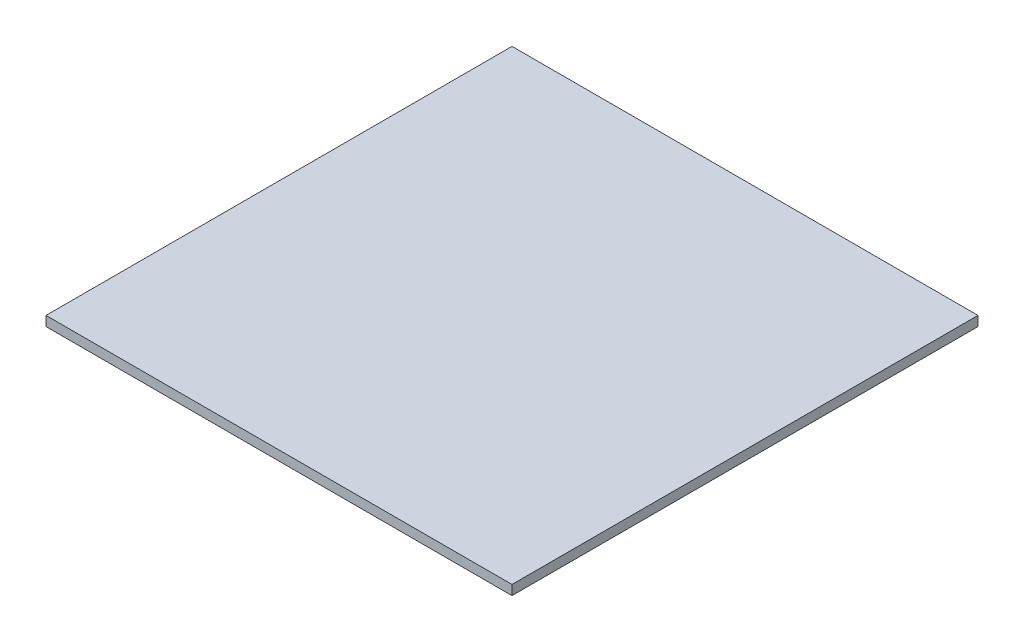
ISO-10303-21;
HEADER;
FILE_DESCRIPTION(('STEP AP214'),'2;1');
FILE_NAME('part.step','',(''),(''),'','','');
FILE_SCHEMA(('AUTOMOTIVE_DESIGN { 1 0 10303 214 1 1 1 1 }'));
ENDSEC;
DATA;
#1=APPLICATION_CONTEXT('core data for automotive mechanical design processes');
#2=APPLICATION_PROTOCOL_DEFINITION('international standard','automotive_design',2000,#1);
#3=PRODUCT_CONTEXT('',#1,'mechanical');
#4=PRODUCT('Part','Part','',(#3));
#5=PRODUCT_RELATED_PRODUCT_CATEGORY('part','',(#4));
#6=PRODUCT_DEFINITION_FORMATION('','',#4);
#7=PRODUCT_DEFINITION_CONTEXT('part definition',#1,'design');
#8=PRODUCT_DEFINITION('design','',#6,#7);
#9=PRODUCT_DEFINITION_SHAPE('','',#8);
#10=(LENGTH_UNIT() NAMED_UNIT(*) SI_UNIT(.MILLI.,.METRE.));
#11=(NAMED_UNIT(*) PLANE_ANGLE_UNIT() SI_UNIT($,.RADIAN.));
#12=(NAMED_UNIT(*) SI_UNIT($,.STERADIAN.) SOLID_ANGLE_UNIT());
#13=UNCERTAINTY_MEASURE_WITH_UNIT(LENGTH_MEASURE(1.E-05),#10,'distance_accuracy_value','');
#14=(GEOMETRIC_REPRESENTATION_CONTEXT(3) GLOBAL_UNCERTAINTY_ASSIGNED_CONTEXT((#13)) GLOBAL_UNIT_ASSIGNED_CONTEXT((#10,
#11,#12)) REPRESENTATION_CONTEXT('',''));
#15=CARTESIAN_POINT('',(0.,0.,0.));
#16=DIRECTION('',(0.,0.,1.));
#17=DIRECTION('',(1.,0.,0.));
#18=AXIS2_PLACEMENT_3D('',#15,#16,#17);
#19=CARTESIAN_POINT('',(438.94375,18.25625,438.94375));
#20=DIRECTION('',(-1.,0.,0.));
#21=DIRECTION('',(0.,0.,1.));
#22=AXIS2_PLACEMENT_3D('',#19,#20,#21);
#23=PLANE('',#22);
#24=DIRECTION('',(0.,0.,-1.));
#25=VECTOR('',#24,1.);
#26=CARTESIAN_POINT('',(438.94375,0.,438.94375));
#27=LINE('',#26,#25);
#28=CARTESIAN_POINT('',(438.94375,0.,438.94375));
#29=VERTEX_POINT('',#28);
#30=CARTESIAN_POINT('',(438.94375,0.,-438.94375));
#31=VERTEX_POINT('',#30);
#32=EDGE_CURVE('E107',#29,#31,#27,.T.);
#33=ORIENTED_EDGE('',*,*,#32,.T.);
#34=DIRECTION('',(0.,-1.,0.));
#35=VECTOR('',#34,1.);
#36=CARTESIAN_POINT('',(438.94375,18.25625,-438.94375));
#37=LINE('',#36,#35);
#38=CARTESIAN_POINT('',(438.94375,18.25625,-438.94375));
#39=VERTEX_POINT('',#38);
#40=EDGE_CURVE('E11',#39,#31,#37,.T.);
#41=ORIENTED_EDGE('',*,*,#40,.F.);
#42=DIRECTION('',(0.,0.,-1.));
#43=VECTOR('',#42,1.);
#44=CARTESIAN_POINT('',(438.94375,18.25625,438.94375));
#45=LINE('',#44,#43);
#46=CARTESIAN_POINT('',(438.94375,18.25625,438.94375));
#47=VERTEX_POINT('',#46);
#48=EDGE_CURVE('E91',#47,#39,#45,.T.);
#49=ORIENTED_EDGE('',*,*,#48,.F.);
#50=DIRECTION('',(0.,-1.,0.));
#51=VECTOR('',#50,1.);
#52=CARTESIAN_POINT('',(438.94375,18.25625,438.94375));
#53=LINE('',#52,#51);
#54=EDGE_CURVE('E103',#47,#29,#53,.T.);
#55=ORIENTED_EDGE('',*,*,#54,.T.);
#56=EDGE_LOOP('',(#33,#41,#49,#55));
#57=FACE_BOUND('',#56,.T.);
#58=ADVANCED_FACE('F39',(#57),#23,.F.);
#59=CARTESIAN_POINT('',(-438.94375,18.25625,-438.94375));
#60=DIRECTION('',(0.,0.,1.));
#61=DIRECTION('',(1.,0.,0.));
#62=AXIS2_PLACEMENT_3D('',#59,#60,#61);
#63=PLANE('',#62);
#64=DIRECTION('',(-1.,0.,0.));
#65=VECTOR('',#64,1.);
#66=CARTESIAN_POINT('',(-438.94375,0.,-438.94375));
#67=LINE('',#66,#65);
#68=CARTESIAN_POINT('',(-438.94375,0.,-438.94375));
#69=VERTEX_POINT('',#68);
#70=EDGE_CURVE('E96',#31,#69,#67,.T.);
#71=ORIENTED_EDGE('',*,*,#70,.T.);
#72=DIRECTION('',(0.,-1.,0.));
#73=VECTOR('',#72,1.);
#74=CARTESIAN_POINT('',(-438.94375,18.25625,-438.94375));
#75=LINE('',#74,#73);
#76=CARTESIAN_POINT('',(-438.94375,18.25625,-438.94375));
#77=VERTEX_POINT('',#76);
#78=EDGE_CURVE('E48',#77,#69,#75,.T.);
#79=ORIENTED_EDGE('',*,*,#78,.F.);
#80=DIRECTION('',(-1.,0.,0.));
#81=VECTOR('',#80,1.);
#82=CARTESIAN_POINT('',(-438.94375,18.25625,-438.94375));
#83=LINE('',#82,#81);
#84=EDGE_CURVE('E86',#39,#77,#83,.T.);
#85=ORIENTED_EDGE('',*,*,#84,.F.);
#86=ORIENTED_EDGE('',*,*,#40,.T.);
#87=EDGE_LOOP('',(#71,#79,#85,#86));
#88=FACE_BOUND('',#87,.T.);
#89=ADVANCED_FACE('F95',(#88),#63,.F.);
#90=CARTESIAN_POINT('',(-438.94375,18.25625,438.94375));
#91=DIRECTION('',(1.,0.,0.));
#92=DIRECTION('',(0.,0.,-1.));
#93=AXIS2_PLACEMENT_3D('',#90,#91,#92);
#94=PLANE('',#93);
#95=DIRECTION('',(0.,0.,1.));
#96=VECTOR('',#95,1.);
#97=CARTESIAN_POINT('',(-438.94375,0.,438.94375));
#98=LINE('',#97,#96);
#99=CARTESIAN_POINT('',(-438.94375,0.,438.94375));
#100=VERTEX_POINT('',#99);
#101=EDGE_CURVE('E73',#69,#100,#98,.T.);
#102=ORIENTED_EDGE('',*,*,#101,.T.);
#103=DIRECTION('',(0.,-1.,0.));
#104=VECTOR('',#103,1.);
#105=CARTESIAN_POINT('',(-438.94375,18.25625,438.94375));
#106=LINE('',#105,#104);
#107=CARTESIAN_POINT('',(-438.94375,18.25625,438.94375));
#108=VERTEX_POINT('',#107);
#109=EDGE_CURVE('E98',#108,#100,#106,.T.);
#110=ORIENTED_EDGE('',*,*,#109,.F.);
#111=DIRECTION('',(0.,0.,1.));
#112=VECTOR('',#111,1.);
#113=CARTESIAN_POINT('',(-438.94375,18.25625,438.94375));
#114=LINE('',#113,#112);
#115=EDGE_CURVE('E89',#77,#108,#114,.T.);
#116=ORIENTED_EDGE('',*,*,#115,.F.);
#117=ORIENTED_EDGE('',*,*,#78,.T.);
#118=EDGE_LOOP('',(#102,#110,#116,#117));
#119=FACE_BOUND('',#118,.T.);
#120=ADVANCED_FACE('F99',(#119),#94,.F.);
#121=CARTESIAN_POINT('',(-438.94375,18.25625,438.94375));
#122=DIRECTION('',(0.,0.,-1.));
#123=DIRECTION('',(-1.,0.,0.));
#124=AXIS2_PLACEMENT_3D('',#121,#122,#123);
#125=PLANE('',#124);
#126=DIRECTION('',(1.,0.,0.));
#127=VECTOR('',#126,1.);
#128=CARTESIAN_POINT('',(-438.94375,0.,438.94375));
#129=LINE('',#128,#127);
#130=EDGE_CURVE('E79',#100,#29,#129,.T.);
#131=ORIENTED_EDGE('',*,*,#130,.T.);
#132=ORIENTED_EDGE('',*,*,#54,.F.);
#133=DIRECTION('',(1.,0.,0.));
#134=VECTOR('',#133,1.);
#135=CARTESIAN_POINT('',(-438.94375,18.25625,438.94375));
#136=LINE('',#135,#134);
#137=EDGE_CURVE('E56',#108,#47,#136,.T.);
#138=ORIENTED_EDGE('',*,*,#137,.F.);
#139=ORIENTED_EDGE('',*,*,#109,.T.);
#140=EDGE_LOOP('',(#131,#132,#138,#139));
#141=FACE_BOUND('',#140,.T.);
#142=ADVANCED_FACE('F120',(#141),#125,.F.);
#143=CARTESIAN_POINT('',(0.,18.25625,0.));
#144=DIRECTION('',(0.,-1.,0.));
#145=DIRECTION('',(0.,0.,-1.));
#146=AXIS2_PLACEMENT_3D('',#143,#144,#145);
#147=PLANE('',#146);
#148=ORIENTED_EDGE('',*,*,#48,.T.);
#149=ORIENTED_EDGE('',*,*,#84,.T.);
#150=ORIENTED_EDGE('',*,*,#115,.T.);
#151=ORIENTED_EDGE('',*,*,#137,.T.);
#152=EDGE_LOOP('',(#148,#149,#150,#151));
#153=FACE_BOUND('',#152,.T.);
#154=ADVANCED_FACE('F87',(#153),#147,.F.);
#155=CARTESIAN_POINT('',(0.,0.,0.));
#156=DIRECTION('',(0.,-1.,0.));
#157=DIRECTION('',(0.,0.,-1.));
#158=AXIS2_PLACEMENT_3D('',#155,#156,#157);
#159=PLANE('',#158);
#160=ORIENTED_EDGE('',*,*,#32,.F.);
#161=ORIENTED_EDGE('',*,*,#130,.F.);
#162=ORIENTED_EDGE('',*,*,#101,.F.);
#163=ORIENTED_EDGE('',*,*,#70,.F.);
#164=EDGE_LOOP('',(#160,#161,#162,#163));
#165=FACE_BOUND('',#164,.T.);
#166=ADVANCED_FACE('F123',(#165),#159,.T.);
#167=CLOSED_SHELL('',(#58,#89,#120,#142,#154,#166));
#168=MANIFOLD_SOLID_BREP('B2',#167);
#169=ADVANCED_BREP_SHAPE_REPRESENTATION('',(#18,#168),#14);
#170=SHAPE_DEFINITION_REPRESENTATION(#9,#169);
ENDSEC;
END-ISO-10303-21;
